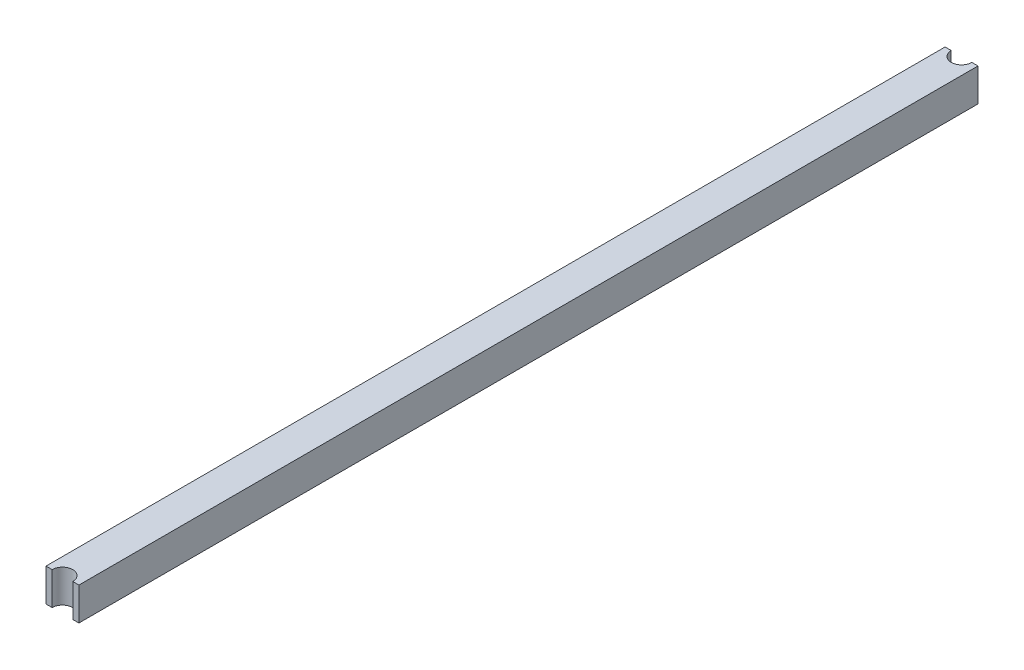
ISO-10303-21;
HEADER;
FILE_DESCRIPTION(('STEP AP214'),'2;1');
FILE_NAME('part.step','',(''),(''),'','','');
FILE_SCHEMA(('AUTOMOTIVE_DESIGN { 1 0 10303 214 1 1 1 1 }'));
ENDSEC;
DATA;
#1=APPLICATION_CONTEXT('core data for automotive mechanical design processes');
#2=APPLICATION_PROTOCOL_DEFINITION('international standard','automotive_design',2000,#1);
#3=PRODUCT_CONTEXT('',#1,'mechanical');
#4=PRODUCT('Part','Part','',(#3));
#5=PRODUCT_RELATED_PRODUCT_CATEGORY('part','',(#4));
#6=PRODUCT_DEFINITION_FORMATION('','',#4);
#7=PRODUCT_DEFINITION_CONTEXT('part definition',#1,'design');
#8=PRODUCT_DEFINITION('design','',#6,#7);
#9=PRODUCT_DEFINITION_SHAPE('','',#8);
#10=(LENGTH_UNIT() NAMED_UNIT(*) SI_UNIT(.MILLI.,.METRE.));
#11=(NAMED_UNIT(*) PLANE_ANGLE_UNIT() SI_UNIT($,.RADIAN.));
#12=(NAMED_UNIT(*) SI_UNIT($,.STERADIAN.) SOLID_ANGLE_UNIT());
#13=UNCERTAINTY_MEASURE_WITH_UNIT(LENGTH_MEASURE(1.E-05),#10,'distance_accuracy_value','');
#14=(GEOMETRIC_REPRESENTATION_CONTEXT(3) GLOBAL_UNCERTAINTY_ASSIGNED_CONTEXT((#13)) GLOBAL_UNIT_ASSIGNED_CONTEXT((#10,
#11,#12)) REPRESENTATION_CONTEXT('',''));
#15=CARTESIAN_POINT('',(0.,0.,0.));
#16=DIRECTION('',(0.,0.,1.));
#17=DIRECTION('',(1.,0.,0.));
#18=AXIS2_PLACEMENT_3D('',#15,#16,#17);
#19=CARTESIAN_POINT('',(0.,0.,850.));
#20=DIRECTION('',(0.,0.,1.));
#21=DIRECTION('',(1.,0.,0.));
#22=AXIS2_PLACEMENT_3D('',#19,#20,#21);
#23=PLANE('',#22);
#24=DIRECTION('',(0.,1.,0.));
#25=VECTOR('',#24,1.);
#26=CARTESIAN_POINT('',(-5.79499999999999,0.,850.));
#27=LINE('',#26,#25);
#28=CARTESIAN_POINT('',(-5.79499999999999,0.,850.));
#29=VERTEX_POINT('',#28);
#30=CARTESIAN_POINT('',(-5.79499999999999,31.1,850.));
#31=VERTEX_POINT('',#30);
#32=EDGE_CURVE('E11',#29,#31,#27,.T.);
#33=ORIENTED_EDGE('',*,*,#32,.F.);
#34=DIRECTION('',(1.,0.,0.));
#35=VECTOR('',#34,1.);
#36=CARTESIAN_POINT('',(0.,0.,850.));
#37=LINE('',#36,#35);
#38=CARTESIAN_POINT('',(0.,0.,850.));
#39=VERTEX_POINT('',#38);
#40=EDGE_CURVE('E156',#29,#39,#37,.T.);
#41=ORIENTED_EDGE('',*,*,#40,.T.);
#42=DIRECTION('',(0.,1.,0.));
#43=VECTOR('',#42,1.);
#44=CARTESIAN_POINT('',(0.,0.,850.));
#45=LINE('',#44,#43);
#46=CARTESIAN_POINT('',(0.,31.1,850.));
#47=VERTEX_POINT('',#46);
#48=EDGE_CURVE('E133',#39,#47,#45,.T.);
#49=ORIENTED_EDGE('',*,*,#48,.T.);
#50=DIRECTION('',(-1.,0.,0.));
#51=VECTOR('',#50,1.);
#52=CARTESIAN_POINT('',(0.,31.1,850.));
#53=LINE('',#52,#51);
#54=EDGE_CURVE('E164',#47,#31,#53,.T.);
#55=ORIENTED_EDGE('',*,*,#54,.T.);
#56=EDGE_LOOP('',(#33,#41,#49,#55));
#57=FACE_BOUND('',#56,.T.);
#58=ADVANCED_FACE('F38',(#57),#23,.T.);
#59=CARTESIAN_POINT('',(0.,0.,0.));
#60=DIRECTION('',(0.,0.,1.));
#61=DIRECTION('',(1.,0.,0.));
#62=AXIS2_PLACEMENT_3D('',#59,#60,#61);
#63=PLANE('',#62);
#64=DIRECTION('',(1.,0.,0.));
#65=VECTOR('',#64,1.);
#66=CARTESIAN_POINT('',(0.,0.,0.));
#67=LINE('',#66,#65);
#68=CARTESIAN_POINT('',(-5.79499999999999,0.,0.));
#69=VERTEX_POINT('',#68);
#70=CARTESIAN_POINT('',(0.,0.,0.));
#71=VERTEX_POINT('',#70);
#72=EDGE_CURVE('E130',#69,#71,#67,.T.);
#73=ORIENTED_EDGE('',*,*,#72,.F.);
#74=DIRECTION('',(0.,1.,0.));
#75=VECTOR('',#74,1.);
#76=CARTESIAN_POINT('',(-5.79499999999999,0.,0.));
#77=LINE('',#76,#75);
#78=CARTESIAN_POINT('',(-5.795,31.1,0.));
#79=VERTEX_POINT('',#78);
#80=EDGE_CURVE('E108',#69,#79,#77,.T.);
#81=ORIENTED_EDGE('',*,*,#80,.T.);
#82=DIRECTION('',(-1.,0.,0.));
#83=VECTOR('',#82,1.);
#84=CARTESIAN_POINT('',(0.,31.1,0.));
#85=LINE('',#84,#83);
#86=CARTESIAN_POINT('',(0.,31.1,0.));
#87=VERTEX_POINT('',#86);
#88=EDGE_CURVE('E118',#87,#79,#85,.T.);
#89=ORIENTED_EDGE('',*,*,#88,.F.);
#90=DIRECTION('',(0.,1.,0.));
#91=VECTOR('',#90,1.);
#92=CARTESIAN_POINT('',(0.,0.,0.));
#93=LINE('',#92,#91);
#94=EDGE_CURVE('E123',#71,#87,#93,.T.);
#95=ORIENTED_EDGE('',*,*,#94,.F.);
#96=EDGE_LOOP('',(#73,#81,#89,#95));
#97=FACE_BOUND('',#96,.T.);
#98=ADVANCED_FACE('F174',(#97),#63,.F.);
#99=CARTESIAN_POINT('',(0.,0.,850.));
#100=DIRECTION('',(-1.,0.,0.));
#101=DIRECTION('',(0.,-1.,0.));
#102=AXIS2_PLACEMENT_3D('',#99,#100,#101);
#103=PLANE('',#102);
#104=ORIENTED_EDGE('',*,*,#94,.T.);
#105=DIRECTION('',(0.,0.,-1.));
#106=VECTOR('',#105,1.);
#107=CARTESIAN_POINT('',(0.,31.1,850.));
#108=LINE('',#107,#106);
#109=EDGE_CURVE('E109',#47,#87,#108,.T.);
#110=ORIENTED_EDGE('',*,*,#109,.F.);
#111=ORIENTED_EDGE('',*,*,#48,.F.);
#112=DIRECTION('',(0.,0.,-1.));
#113=VECTOR('',#112,1.);
#114=CARTESIAN_POINT('',(0.,0.,850.));
#115=LINE('',#114,#113);
#116=EDGE_CURVE('E134',#39,#71,#115,.T.);
#117=ORIENTED_EDGE('',*,*,#116,.T.);
#118=EDGE_LOOP('',(#104,#110,#111,#117));
#119=FACE_BOUND('',#118,.T.);
#120=ADVANCED_FACE('F40',(#119),#103,.F.);
#121=CARTESIAN_POINT('',(0.,31.1,850.));
#122=DIRECTION('',(0.,-1.,0.));
#123=DIRECTION('',(1.,0.,0.));
#124=AXIS2_PLACEMENT_3D('',#121,#122,#123);
#125=PLANE('',#124);
#126=ORIENTED_EDGE('',*,*,#88,.T.);
#127=CARTESIAN_POINT('',(-15.55,31.1,0.));
#128=DIRECTION('',(0.,1.,0.));
#129=DIRECTION('',(-1.,0.,0.));
#130=AXIS2_PLACEMENT_3D('',#127,#128,#129);
#131=CIRCLE('',#130,9.755);
#132=CARTESIAN_POINT('',(-25.305,31.1,0.));
#133=VERTEX_POINT('',#132);
#134=EDGE_CURVE('E102',#133,#79,#131,.T.);
#135=ORIENTED_EDGE('',*,*,#134,.F.);
#136=CARTESIAN_POINT('',(-31.1,31.1,0.));
#137=VERTEX_POINT('',#136);
#138=EDGE_CURVE('E115',#133,#137,#85,.T.);
#139=ORIENTED_EDGE('',*,*,#138,.T.);
#140=DIRECTION('',(0.,0.,-1.));
#141=VECTOR('',#140,1.);
#142=CARTESIAN_POINT('',(-31.1,31.1,850.));
#143=LINE('',#142,#141);
#144=CARTESIAN_POINT('',(-31.1,31.1,850.));
#145=VERTEX_POINT('',#144);
#146=EDGE_CURVE('E141',#145,#137,#143,.T.);
#147=ORIENTED_EDGE('',*,*,#146,.F.);
#148=CARTESIAN_POINT('',(-25.305,31.1,850.));
#149=VERTEX_POINT('',#148);
#150=EDGE_CURVE('E167',#149,#145,#53,.T.);
#151=ORIENTED_EDGE('',*,*,#150,.F.);
#152=CARTESIAN_POINT('',(-15.55,31.1,850.));
#153=DIRECTION('',(0.,1.,0.));
#154=DIRECTION('',(-1.,0.,0.));
#155=AXIS2_PLACEMENT_3D('',#152,#153,#154);
#156=CIRCLE('',#155,9.75500000000001);
#157=EDGE_CURVE('E52',#31,#149,#156,.T.);
#158=ORIENTED_EDGE('',*,*,#157,.F.);
#159=ORIENTED_EDGE('',*,*,#54,.F.);
#160=ORIENTED_EDGE('',*,*,#109,.T.);
#161=EDGE_LOOP('',(#126,#135,#139,#147,#151,#158,#159,#160));
#162=FACE_BOUND('',#161,.T.);
#163=ADVANCED_FACE('F113',(#162),#125,.F.);
#164=CARTESIAN_POINT('',(-31.1,0.,850.));
#165=DIRECTION('',(1.,0.,0.));
#166=DIRECTION('',(0.,0.,-1.));
#167=AXIS2_PLACEMENT_3D('',#164,#165,#166);
#168=PLANE('',#167);
#169=DIRECTION('',(0.,-1.,0.));
#170=VECTOR('',#169,1.);
#171=CARTESIAN_POINT('',(-31.1,0.,0.));
#172=LINE('',#171,#170);
#173=CARTESIAN_POINT('',(-31.1,0.,0.));
#174=VERTEX_POINT('',#173);
#175=EDGE_CURVE('E122',#137,#174,#172,.T.);
#176=ORIENTED_EDGE('',*,*,#175,.T.);
#177=DIRECTION('',(0.,0.,-1.));
#178=VECTOR('',#177,1.);
#179=CARTESIAN_POINT('',(-31.1,0.,850.));
#180=LINE('',#179,#178);
#181=CARTESIAN_POINT('',(-31.1,0.,850.));
#182=VERTEX_POINT('',#181);
#183=EDGE_CURVE('E137',#182,#174,#180,.T.);
#184=ORIENTED_EDGE('',*,*,#183,.F.);
#185=DIRECTION('',(0.,-1.,0.));
#186=VECTOR('',#185,1.);
#187=CARTESIAN_POINT('',(-31.1,0.,850.));
#188=LINE('',#187,#186);
#189=EDGE_CURVE('E160',#145,#182,#188,.T.);
#190=ORIENTED_EDGE('',*,*,#189,.F.);
#191=ORIENTED_EDGE('',*,*,#146,.T.);
#192=EDGE_LOOP('',(#176,#184,#190,#191));
#193=FACE_BOUND('',#192,.T.);
#194=ADVANCED_FACE('F180',(#193),#168,.F.);
#195=CARTESIAN_POINT('',(0.,0.,850.));
#196=DIRECTION('',(0.,1.,0.));
#197=DIRECTION('',(-1.,0.,0.));
#198=AXIS2_PLACEMENT_3D('',#195,#196,#197);
#199=PLANE('',#198);
#200=CARTESIAN_POINT('',(-25.305,0.,0.));
#201=VERTEX_POINT('',#200);
#202=EDGE_CURVE('E131',#174,#201,#67,.T.);
#203=ORIENTED_EDGE('',*,*,#202,.T.);
#204=CARTESIAN_POINT('',(-15.55,0.,0.));
#205=DIRECTION('',(0.,1.,0.));
#206=DIRECTION('',(-1.,0.,0.));
#207=AXIS2_PLACEMENT_3D('',#204,#205,#206);
#208=CIRCLE('',#207,9.755);
#209=EDGE_CURVE('E60',#201,#69,#208,.T.);
#210=ORIENTED_EDGE('',*,*,#209,.T.);
#211=ORIENTED_EDGE('',*,*,#72,.T.);
#212=ORIENTED_EDGE('',*,*,#116,.F.);
#213=ORIENTED_EDGE('',*,*,#40,.F.);
#214=CARTESIAN_POINT('',(-15.55,0.,850.));
#215=DIRECTION('',(0.,1.,0.));
#216=DIRECTION('',(-1.,0.,0.));
#217=AXIS2_PLACEMENT_3D('',#214,#215,#216);
#218=CIRCLE('',#217,9.75500000000001);
#219=CARTESIAN_POINT('',(-25.305,0.,850.));
#220=VERTEX_POINT('',#219);
#221=EDGE_CURVE('E146',#29,#220,#218,.T.);
#222=ORIENTED_EDGE('',*,*,#221,.T.);
#223=EDGE_CURVE('E138',#182,#220,#37,.T.);
#224=ORIENTED_EDGE('',*,*,#223,.F.);
#225=ORIENTED_EDGE('',*,*,#183,.T.);
#226=EDGE_LOOP('',(#203,#210,#211,#212,#213,#222,#224,#225));
#227=FACE_BOUND('',#226,.T.);
#228=ADVANCED_FACE('F154',(#227),#199,.F.);
#229=DIRECTION('',(0.,1.,0.));
#230=VECTOR('',#229,1.);
#231=CARTESIAN_POINT('',(-25.305,0.,850.));
#232=LINE('',#231,#230);
#233=EDGE_CURVE('E46',#149,#220,#232,.F.);
#234=ORIENTED_EDGE('',*,*,#233,.F.);
#235=ORIENTED_EDGE('',*,*,#150,.T.);
#236=ORIENTED_EDGE('',*,*,#189,.T.);
#237=ORIENTED_EDGE('',*,*,#223,.T.);
#238=EDGE_LOOP('',(#234,#235,#236,#237));
#239=FACE_BOUND('',#238,.T.);
#240=ADVANCED_FACE('F158',(#239),#23,.T.);
#241=ORIENTED_EDGE('',*,*,#138,.F.);
#242=DIRECTION('',(0.,1.,0.));
#243=VECTOR('',#242,1.);
#244=CARTESIAN_POINT('',(-25.305,0.,0.));
#245=LINE('',#244,#243);
#246=EDGE_CURVE('E99',#133,#201,#245,.F.);
#247=ORIENTED_EDGE('',*,*,#246,.T.);
#248=ORIENTED_EDGE('',*,*,#202,.F.);
#249=ORIENTED_EDGE('',*,*,#175,.F.);
#250=EDGE_LOOP('',(#241,#247,#248,#249));
#251=FACE_BOUND('',#250,.T.);
#252=ADVANCED_FACE('F121',(#251),#63,.F.);
#253=CARTESIAN_POINT('',(-15.55,0.,0.));
#254=DIRECTION('',(0.,1.,0.));
#255=DIRECTION('',(-1.,0.,0.));
#256=AXIS2_PLACEMENT_3D('',#253,#254,#255);
#257=CYLINDRICAL_SURFACE('',#256,9.755);
#258=ORIENTED_EDGE('',*,*,#209,.F.);
#259=ORIENTED_EDGE('',*,*,#246,.F.);
#260=ORIENTED_EDGE('',*,*,#134,.T.);
#261=ORIENTED_EDGE('',*,*,#80,.F.);
#262=EDGE_LOOP('',(#258,#259,#260,#261));
#263=FACE_BOUND('',#262,.T.);
#264=ADVANCED_FACE('F101',(#263),#257,.F.);
#265=CARTESIAN_POINT('',(-15.55,0.,850.));
#266=DIRECTION('',(0.,1.,0.));
#267=DIRECTION('',(-1.,0.,0.));
#268=AXIS2_PLACEMENT_3D('',#265,#266,#267);
#269=CYLINDRICAL_SURFACE('',#268,9.75500000000001);
#270=ORIENTED_EDGE('',*,*,#32,.T.);
#271=ORIENTED_EDGE('',*,*,#157,.T.);
#272=ORIENTED_EDGE('',*,*,#233,.T.);
#273=ORIENTED_EDGE('',*,*,#221,.F.);
#274=EDGE_LOOP('',(#270,#271,#272,#273));
#275=FACE_BOUND('',#274,.T.);
#276=ADVANCED_FACE('F145',(#275),#269,.F.);
#277=CLOSED_SHELL('',(#58,#98,#120,#163,#194,#228,#240,#252,#264,#276));
#278=MANIFOLD_SOLID_BREP('B2',#277);
#279=ADVANCED_BREP_SHAPE_REPRESENTATION('',(#18,#278),#14);
#280=SHAPE_DEFINITION_REPRESENTATION(#9,#279);
ENDSEC;
END-ISO-10303-21;
